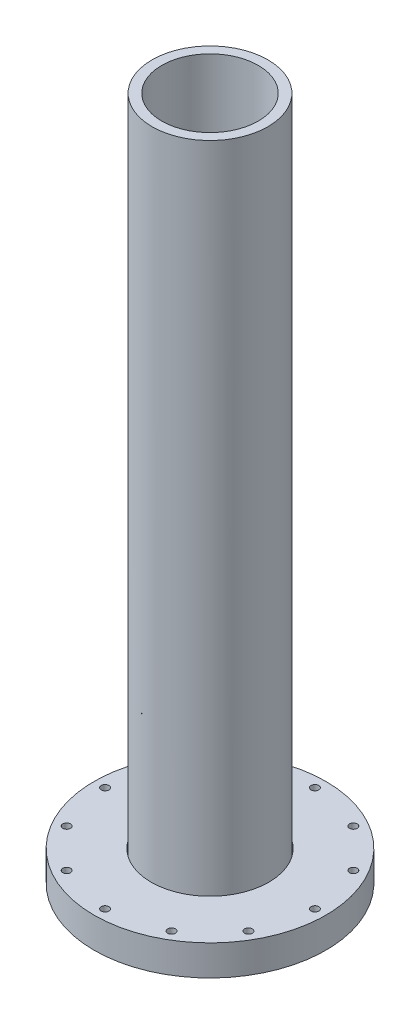
ISO-10303-21;
HEADER;
FILE_DESCRIPTION(('STEP AP214'),'2;1');
FILE_NAME('part.step','',(''),(''),'','','');
FILE_SCHEMA(('AUTOMOTIVE_DESIGN { 1 0 10303 214 1 1 1 1 }'));
ENDSEC;
DATA;
#1=APPLICATION_CONTEXT('core data for automotive mechanical design processes');
#2=APPLICATION_PROTOCOL_DEFINITION('international standard','automotive_design',2000,#1);
#3=PRODUCT_CONTEXT('',#1,'mechanical');
#4=PRODUCT('Part','Part','',(#3));
#5=PRODUCT_RELATED_PRODUCT_CATEGORY('part','',(#4));
#6=PRODUCT_DEFINITION_FORMATION('','',#4);
#7=PRODUCT_DEFINITION_CONTEXT('part definition',#1,'design');
#8=PRODUCT_DEFINITION('design','',#6,#7);
#9=PRODUCT_DEFINITION_SHAPE('','',#8);
#10=(LENGTH_UNIT() NAMED_UNIT(*) SI_UNIT(.MILLI.,.METRE.));
#11=(NAMED_UNIT(*) PLANE_ANGLE_UNIT() SI_UNIT($,.RADIAN.));
#12=(NAMED_UNIT(*) SI_UNIT($,.STERADIAN.) SOLID_ANGLE_UNIT());
#13=UNCERTAINTY_MEASURE_WITH_UNIT(LENGTH_MEASURE(1.E-05),#10,'distance_accuracy_value','');
#14=(GEOMETRIC_REPRESENTATION_CONTEXT(3) GLOBAL_UNCERTAINTY_ASSIGNED_CONTEXT((#13)) GLOBAL_UNIT_ASSIGNED_CONTEXT((#10,
#11,#12)) REPRESENTATION_CONTEXT('',''));
#15=CARTESIAN_POINT('',(0.,0.,0.));
#16=DIRECTION('',(0.,0.,1.));
#17=DIRECTION('',(1.,0.,0.));
#18=AXIS2_PLACEMENT_3D('',#15,#16,#17);
#19=CARTESIAN_POINT('',(0.,20.,0.));
#20=DIRECTION('',(0.,-1.,0.));
#21=DIRECTION('',(0.,0.,-1.));
#22=AXIS2_PLACEMENT_3D('',#19,#20,#21);
#23=CYLINDRICAL_SURFACE('',#22,38.6715);
#24=CARTESIAN_POINT('',(0.,20.,0.));
#25=DIRECTION('',(0.,1.,0.));
#26=DIRECTION('',(0.,0.,1.));
#27=AXIS2_PLACEMENT_3D('',#24,#25,#26);
#28=CIRCLE('',#27,38.6715);
#29=CARTESIAN_POINT('',(0.,20.,38.6715));
#30=VERTEX_POINT('',#29);
#31=EDGE_CURVE('E60',#30,#30,#28,.T.);
#32=ORIENTED_EDGE('',*,*,#31,.T.);
#33=EDGE_LOOP('',(#32));
#34=FACE_BOUND('',#33,.T.);
#35=CARTESIAN_POINT('',(0.,2.,0.));
#36=DIRECTION('',(0.,-1.,0.));
#37=DIRECTION('',(0.,0.,-1.));
#38=AXIS2_PLACEMENT_3D('',#35,#36,#37);
#39=CIRCLE('',#38,38.6715);
#40=CARTESIAN_POINT('',(0.,2.,-38.6715));
#41=VERTEX_POINT('',#40);
#42=EDGE_CURVE('E51',#41,#41,#39,.T.);
#43=ORIENTED_EDGE('',*,*,#42,.T.);
#44=EDGE_LOOP('',(#43));
#45=FACE_BOUND('',#44,.T.);
#46=ADVANCED_FACE('F47',(#34,#45),#23,.F.);
#47=CARTESIAN_POINT('',(0.,0.,0.));
#48=DIRECTION('',(0.,1.,0.));
#49=DIRECTION('',(0.,0.,1.));
#50=AXIS2_PLACEMENT_3D('',#47,#48,#49);
#51=PLANE('',#50);
#52=CARTESIAN_POINT('',(0.,0.,0.));
#53=DIRECTION('',(0.,-1.,0.));
#54=DIRECTION('',(0.,0.,-1.));
#55=AXIS2_PLACEMENT_3D('',#52,#53,#54);
#56=CIRCLE('',#55,55.14);
#57=CARTESIAN_POINT('',(0.,0.,-55.14));
#58=VERTEX_POINT('',#57);
#59=EDGE_CURVE('E140',#58,#58,#56,.T.);
#60=ORIENTED_EDGE('',*,*,#59,.F.);
#61=EDGE_LOOP('',(#60));
#62=FACE_BOUND('',#61,.T.);
#63=CARTESIAN_POINT('',(59.7557528611262,0.,-34.5000000000001));
#64=DIRECTION('',(0.,-1.,0.));
#65=DIRECTION('',(0.,0.,-1.));
#66=AXIS2_PLACEMENT_3D('',#63,#64,#65);
#67=CIRCLE('',#66,2.55269999999994);
#68=CARTESIAN_POINT('',(59.7557528611262,0.,-37.0527));
#69=VERTEX_POINT('',#68);
#70=EDGE_CURVE('E131',#69,#69,#67,.T.);
#71=ORIENTED_EDGE('',*,*,#70,.F.);
#72=EDGE_LOOP('',(#71));
#73=FACE_BOUND('',#72,.T.);
#74=CARTESIAN_POINT('',(34.4999999999999,0.,-59.7557528611264));
#75=DIRECTION('',(0.,-1.,0.));
#76=DIRECTION('',(0.,0.,-1.));
#77=AXIS2_PLACEMENT_3D('',#74,#75,#76);
#78=CIRCLE('',#77,2.55269999999994);
#79=CARTESIAN_POINT('',(34.4999999999999,0.,-62.3084528611263));
#80=VERTEX_POINT('',#79);
#81=EDGE_CURVE('E125',#80,#80,#78,.T.);
#82=ORIENTED_EDGE('',*,*,#81,.F.);
#83=EDGE_LOOP('',(#82));
#84=FACE_BOUND('',#83,.T.);
#85=CARTESIAN_POINT('',(-2.40912212380176E-13,0.,-69.));
#86=DIRECTION('',(0.,-1.,0.));
#87=DIRECTION('',(0.,0.,-1.));
#88=AXIS2_PLACEMENT_3D('',#85,#86,#87);
#89=CIRCLE('',#88,2.55269999999995);
#90=CARTESIAN_POINT('',(-2.40912212380176E-13,0.,-71.5527));
#91=VERTEX_POINT('',#90);
#92=EDGE_CURVE('E119',#91,#91,#89,.T.);
#93=ORIENTED_EDGE('',*,*,#92,.F.);
#94=EDGE_LOOP('',(#93));
#95=FACE_BOUND('',#94,.T.);
#96=CARTESIAN_POINT('',(-34.5000000000003,0.,-59.7557528611261));
#97=DIRECTION('',(0.,-1.,0.));
#98=DIRECTION('',(0.,0.,-1.));
#99=AXIS2_PLACEMENT_3D('',#96,#97,#98);
#100=CIRCLE('',#99,2.55269999999994);
#101=CARTESIAN_POINT('',(-34.5000000000003,0.,-62.3084528611261));
#102=VERTEX_POINT('',#101);
#103=EDGE_CURVE('E113',#102,#102,#100,.T.);
#104=ORIENTED_EDGE('',*,*,#103,.F.);
#105=EDGE_LOOP('',(#104));
#106=FACE_BOUND('',#105,.T.);
#107=CARTESIAN_POINT('',(-59.7557528611265,0.,-34.4999999999997));
#108=DIRECTION('',(0.,-1.,0.));
#109=DIRECTION('',(0.,0.,-1.));
#110=AXIS2_PLACEMENT_3D('',#107,#108,#109);
#111=CIRCLE('',#110,2.55269999999994);
#112=CARTESIAN_POINT('',(-59.7557528611265,0.,-37.0526999999996));
#113=VERTEX_POINT('',#112);
#114=EDGE_CURVE('E107',#113,#113,#111,.T.);
#115=ORIENTED_EDGE('',*,*,#114,.F.);
#116=EDGE_LOOP('',(#115));
#117=FACE_BOUND('',#116,.T.);
#118=CARTESIAN_POINT('',(-69.,0.,4.81824424760352E-13));
#119=DIRECTION('',(0.,-1.,0.));
#120=DIRECTION('',(0.,0.,-1.));
#121=AXIS2_PLACEMENT_3D('',#118,#119,#120);
#122=CIRCLE('',#121,2.55269999999995);
#123=CARTESIAN_POINT('',(-69.,0.,-2.55269999999947));
#124=VERTEX_POINT('',#123);
#125=EDGE_CURVE('E101',#124,#124,#122,.T.);
#126=ORIENTED_EDGE('',*,*,#125,.F.);
#127=EDGE_LOOP('',(#126));
#128=FACE_BOUND('',#127,.T.);
#129=CARTESIAN_POINT('',(-59.755752861126,0.,34.5000000000005));
#130=DIRECTION('',(0.,-1.,0.));
#131=DIRECTION('',(0.,0.,-1.));
#132=AXIS2_PLACEMENT_3D('',#129,#130,#131);
#133=CIRCLE('',#132,2.55269999999994);
#134=CARTESIAN_POINT('',(-59.755752861126,0.,31.9473000000006));
#135=VERTEX_POINT('',#134);
#136=EDGE_CURVE('E95',#135,#135,#133,.T.);
#137=ORIENTED_EDGE('',*,*,#136,.F.);
#138=EDGE_LOOP('',(#137));
#139=FACE_BOUND('',#138,.T.);
#140=CARTESIAN_POINT('',(-34.4999999999994,0.,59.7557528611266));
#141=DIRECTION('',(0.,-1.,0.));
#142=DIRECTION('',(0.,0.,-1.));
#143=AXIS2_PLACEMENT_3D('',#140,#141,#142);
#144=CIRCLE('',#143,2.55269999999994);
#145=CARTESIAN_POINT('',(-34.4999999999994,0.,57.2030528611266));
#146=VERTEX_POINT('',#145);
#147=EDGE_CURVE('E89',#146,#146,#144,.T.);
#148=ORIENTED_EDGE('',*,*,#147,.F.);
#149=EDGE_LOOP('',(#148));
#150=FACE_BOUND('',#149,.T.);
#151=CARTESIAN_POINT('',(7.22736637140529E-13,0.,69.));
#152=DIRECTION('',(0.,-1.,0.));
#153=DIRECTION('',(0.,0.,-1.));
#154=AXIS2_PLACEMENT_3D('',#151,#152,#153);
#155=CIRCLE('',#154,2.55269999999995);
#156=CARTESIAN_POINT('',(7.22736637140529E-13,0.,66.4473000000001));
#157=VERTEX_POINT('',#156);
#158=EDGE_CURVE('E83',#157,#157,#155,.T.);
#159=ORIENTED_EDGE('',*,*,#158,.F.);
#160=EDGE_LOOP('',(#159));
#161=FACE_BOUND('',#160,.T.);
#162=CARTESIAN_POINT('',(34.5000000000007,0.,59.7557528611259));
#163=DIRECTION('',(0.,-1.,0.));
#164=DIRECTION('',(0.,0.,-1.));
#165=AXIS2_PLACEMENT_3D('',#162,#163,#164);
#166=CIRCLE('',#165,2.55269999999994);
#167=CARTESIAN_POINT('',(34.5000000000007,0.,57.2030528611259));
#168=VERTEX_POINT('',#167);
#169=EDGE_CURVE('E75',#168,#168,#166,.T.);
#170=ORIENTED_EDGE('',*,*,#169,.F.);
#171=EDGE_LOOP('',(#170));
#172=FACE_BOUND('',#171,.T.);
#173=CARTESIAN_POINT('',(59.7557528611267,0.,34.4999999999992));
#174=DIRECTION('',(0.,-1.,0.));
#175=DIRECTION('',(0.,0.,-1.));
#176=AXIS2_PLACEMENT_3D('',#173,#174,#175);
#177=CIRCLE('',#176,2.55269999999994);
#178=CARTESIAN_POINT('',(59.7557528611267,0.,31.9472999999993));
#179=VERTEX_POINT('',#178);
#180=EDGE_CURVE('E66',#179,#179,#177,.T.);
#181=ORIENTED_EDGE('',*,*,#180,.F.);
#182=EDGE_LOOP('',(#181));
#183=FACE_BOUND('',#182,.T.);
#184=CARTESIAN_POINT('',(0.,0.,0.));
#185=DIRECTION('',(0.,1.,0.));
#186=DIRECTION('',(0.,0.,1.));
#187=AXIS2_PLACEMENT_3D('',#184,#185,#186);
#188=CIRCLE('',#187,76.2);
#189=CARTESIAN_POINT('',(0.,0.,76.2));
#190=VERTEX_POINT('',#189);
#191=EDGE_CURVE('E55',#190,#190,#188,.T.);
#192=ORIENTED_EDGE('',*,*,#191,.F.);
#193=EDGE_LOOP('',(#192));
#194=FACE_BOUND('',#193,.T.);
#195=CARTESIAN_POINT('',(69.,0.,0.));
#196=DIRECTION('',(0.,-1.,0.));
#197=DIRECTION('',(0.,0.,-1.));
#198=AXIS2_PLACEMENT_3D('',#195,#196,#197);
#199=CIRCLE('',#198,2.55269999999995);
#200=CARTESIAN_POINT('',(69.,0.,-2.55269999999995));
#201=VERTEX_POINT('',#200);
#202=EDGE_CURVE('E137',#201,#201,#199,.T.);
#203=ORIENTED_EDGE('',*,*,#202,.F.);
#204=EDGE_LOOP('',(#203));
#205=FACE_BOUND('',#204,.T.);
#206=ADVANCED_FACE('F162',(#62,#73,#84,#95,#106,#117,#128,#139,#150,#161,#172,#183,#194,#205),
#51,.F.);
#207=CARTESIAN_POINT('',(0.,20.,0.));
#208=DIRECTION('',(0.,1.,0.));
#209=DIRECTION('',(0.,0.,1.));
#210=AXIS2_PLACEMENT_3D('',#207,#208,#209);
#211=PLANE('',#210);
#212=CARTESIAN_POINT('',(69.,20.,0.));
#213=DIRECTION('',(0.,1.,0.));
#214=DIRECTION('',(0.,0.,1.));
#215=AXIS2_PLACEMENT_3D('',#212,#213,#214);
#216=CIRCLE('',#215,2.55269999999995);
#217=CARTESIAN_POINT('',(69.,20.,2.55269999999995));
#218=VERTEX_POINT('',#217);
#219=EDGE_CURVE('E134',#218,#218,#216,.T.);
#220=ORIENTED_EDGE('',*,*,#219,.F.);
#221=EDGE_LOOP('',(#220));
#222=FACE_BOUND('',#221,.T.);
#223=CARTESIAN_POINT('',(59.7557528611262,20.,-34.5000000000001));
#224=DIRECTION('',(0.,1.,0.));
#225=DIRECTION('',(0.,0.,1.));
#226=AXIS2_PLACEMENT_3D('',#223,#224,#225);
#227=CIRCLE('',#226,2.55269999999994);
#228=CARTESIAN_POINT('',(59.7557528611262,20.,-31.9473000000001));
#229=VERTEX_POINT('',#228);
#230=EDGE_CURVE('E128',#229,#229,#227,.T.);
#231=ORIENTED_EDGE('',*,*,#230,.F.);
#232=EDGE_LOOP('',(#231));
#233=FACE_BOUND('',#232,.T.);
#234=CARTESIAN_POINT('',(34.4999999999999,20.,-59.7557528611264));
#235=DIRECTION('',(0.,1.,0.));
#236=DIRECTION('',(0.,0.,1.));
#237=AXIS2_PLACEMENT_3D('',#234,#235,#236);
#238=CIRCLE('',#237,2.55269999999994);
#239=CARTESIAN_POINT('',(34.4999999999999,20.,-57.2030528611264));
#240=VERTEX_POINT('',#239);
#241=EDGE_CURVE('E122',#240,#240,#238,.T.);
#242=ORIENTED_EDGE('',*,*,#241,.F.);
#243=EDGE_LOOP('',(#242));
#244=FACE_BOUND('',#243,.T.);
#245=CARTESIAN_POINT('',(-2.40912212380176E-13,20.,-69.));
#246=DIRECTION('',(0.,1.,0.));
#247=DIRECTION('',(0.,0.,1.));
#248=AXIS2_PLACEMENT_3D('',#245,#246,#247);
#249=CIRCLE('',#248,2.55269999999994);
#250=CARTESIAN_POINT('',(-2.40912212380176E-13,20.,-66.4473000000001));
#251=VERTEX_POINT('',#250);
#252=EDGE_CURVE('E116',#251,#251,#249,.T.);
#253=ORIENTED_EDGE('',*,*,#252,.F.);
#254=EDGE_LOOP('',(#253));
#255=FACE_BOUND('',#254,.T.);
#256=CARTESIAN_POINT('',(-34.5000000000003,20.,-59.7557528611261));
#257=DIRECTION('',(0.,1.,0.));
#258=DIRECTION('',(0.,0.,1.));
#259=AXIS2_PLACEMENT_3D('',#256,#257,#258);
#260=CIRCLE('',#259,2.55269999999994);
#261=CARTESIAN_POINT('',(-34.5000000000003,20.,-57.2030528611262));
#262=VERTEX_POINT('',#261);
#263=EDGE_CURVE('E110',#262,#262,#260,.T.);
#264=ORIENTED_EDGE('',*,*,#263,.F.);
#265=EDGE_LOOP('',(#264));
#266=FACE_BOUND('',#265,.T.);
#267=CARTESIAN_POINT('',(-59.7557528611265,20.,-34.4999999999997));
#268=DIRECTION('',(0.,1.,0.));
#269=DIRECTION('',(0.,0.,1.));
#270=AXIS2_PLACEMENT_3D('',#267,#268,#269);
#271=CIRCLE('',#270,2.55269999999994);
#272=CARTESIAN_POINT('',(-59.7557528611265,20.,-31.9472999999997));
#273=VERTEX_POINT('',#272);
#274=EDGE_CURVE('E104',#273,#273,#271,.T.);
#275=ORIENTED_EDGE('',*,*,#274,.F.);
#276=EDGE_LOOP('',(#275));
#277=FACE_BOUND('',#276,.T.);
#278=CARTESIAN_POINT('',(-69.,20.,4.81824424760352E-13));
#279=DIRECTION('',(0.,1.,0.));
#280=DIRECTION('',(0.,0.,1.));
#281=AXIS2_PLACEMENT_3D('',#278,#279,#280);
#282=CIRCLE('',#281,2.55269999999995);
#283=CARTESIAN_POINT('',(-69.,20.,2.55270000000043));
#284=VERTEX_POINT('',#283);
#285=EDGE_CURVE('E98',#284,#284,#282,.T.);
#286=ORIENTED_EDGE('',*,*,#285,.F.);
#287=EDGE_LOOP('',(#286));
#288=FACE_BOUND('',#287,.T.);
#289=CARTESIAN_POINT('',(-59.755752861126,20.,34.5000000000005));
#290=DIRECTION('',(0.,1.,0.));
#291=DIRECTION('',(0.,0.,1.));
#292=AXIS2_PLACEMENT_3D('',#289,#290,#291);
#293=CIRCLE('',#292,2.55269999999994);
#294=CARTESIAN_POINT('',(-59.755752861126,20.,37.0527000000004));
#295=VERTEX_POINT('',#294);
#296=EDGE_CURVE('E92',#295,#295,#293,.T.);
#297=ORIENTED_EDGE('',*,*,#296,.F.);
#298=EDGE_LOOP('',(#297));
#299=FACE_BOUND('',#298,.T.);
#300=CARTESIAN_POINT('',(-34.4999999999994,20.,59.7557528611266));
#301=DIRECTION('',(0.,1.,0.));
#302=DIRECTION('',(0.,0.,1.));
#303=AXIS2_PLACEMENT_3D('',#300,#301,#302);
#304=CIRCLE('',#303,2.55269999999994);
#305=CARTESIAN_POINT('',(-34.4999999999994,20.,62.3084528611265));
#306=VERTEX_POINT('',#305);
#307=EDGE_CURVE('E86',#306,#306,#304,.T.);
#308=ORIENTED_EDGE('',*,*,#307,.F.);
#309=EDGE_LOOP('',(#308));
#310=FACE_BOUND('',#309,.T.);
#311=CARTESIAN_POINT('',(7.22736637140529E-13,20.,69.));
#312=DIRECTION('',(0.,1.,0.));
#313=DIRECTION('',(0.,0.,1.));
#314=AXIS2_PLACEMENT_3D('',#311,#312,#313);
#315=CIRCLE('',#314,2.55269999999994);
#316=CARTESIAN_POINT('',(7.22736637140529E-13,20.,71.5527));
#317=VERTEX_POINT('',#316);
#318=EDGE_CURVE('E80',#317,#317,#315,.T.);
#319=ORIENTED_EDGE('',*,*,#318,.F.);
#320=EDGE_LOOP('',(#319));
#321=FACE_BOUND('',#320,.T.);
#322=CARTESIAN_POINT('',(34.5000000000007,20.,59.7557528611259));
#323=DIRECTION('',(0.,1.,0.));
#324=DIRECTION('',(0.,0.,1.));
#325=AXIS2_PLACEMENT_3D('',#322,#323,#324);
#326=CIRCLE('',#325,2.55269999999994);
#327=CARTESIAN_POINT('',(34.5000000000007,20.,62.3084528611258));
#328=VERTEX_POINT('',#327);
#329=EDGE_CURVE('E71',#328,#328,#326,.T.);
#330=ORIENTED_EDGE('',*,*,#329,.F.);
#331=EDGE_LOOP('',(#330));
#332=FACE_BOUND('',#331,.T.);
#333=CARTESIAN_POINT('',(59.7557528611267,20.,34.4999999999992));
#334=DIRECTION('',(0.,1.,0.));
#335=DIRECTION('',(0.,0.,1.));
#336=AXIS2_PLACEMENT_3D('',#333,#334,#335);
#337=CIRCLE('',#336,2.55269999999994);
#338=CARTESIAN_POINT('',(59.7557528611267,20.,37.0526999999992));
#339=VERTEX_POINT('',#338);
#340=EDGE_CURVE('E64',#339,#339,#337,.T.);
#341=ORIENTED_EDGE('',*,*,#340,.F.);
#342=EDGE_LOOP('',(#341));
#343=FACE_BOUND('',#342,.T.);
#344=CARTESIAN_POINT('',(0.,20.,0.));
#345=DIRECTION('',(0.,1.,0.));
#346=DIRECTION('',(0.,0.,1.));
#347=AXIS2_PLACEMENT_3D('',#344,#345,#346);
#348=CIRCLE('',#347,76.2);
#349=CARTESIAN_POINT('',(0.,20.,76.2));
#350=VERTEX_POINT('',#349);
#351=EDGE_CURVE('E11',#350,#350,#348,.T.);
#352=ORIENTED_EDGE('',*,*,#351,.T.);
#353=EDGE_LOOP('',(#352));
#354=FACE_BOUND('',#353,.T.);
#355=ORIENTED_EDGE('',*,*,#31,.F.);
#356=EDGE_LOOP('',(#355));
#357=FACE_BOUND('',#356,.T.);
#358=ADVANCED_FACE('F168',(#222,#233,#244,#255,#266,#277,#288,#299,#310,#321,#332,#343,#354,
#357),#211,.T.);
#359=CARTESIAN_POINT('',(0.,20.,0.));
#360=DIRECTION('',(0.,-1.,0.));
#361=DIRECTION('',(0.,0.,-1.));
#362=AXIS2_PLACEMENT_3D('',#359,#360,#361);
#363=CYLINDRICAL_SURFACE('',#362,76.2);
#364=ORIENTED_EDGE('',*,*,#351,.F.);
#365=EDGE_LOOP('',(#364));
#366=FACE_BOUND('',#365,.T.);
#367=ORIENTED_EDGE('',*,*,#191,.T.);
#368=EDGE_LOOP('',(#367));
#369=FACE_BOUND('',#368,.T.);
#370=ADVANCED_FACE('F49',(#366,#369),#363,.T.);
#371=CARTESIAN_POINT('',(59.7557528611267,0.,34.4999999999992));
#372=DIRECTION('',(0.,-1.,0.));
#373=DIRECTION('',(0.,0.,-1.));
#374=AXIS2_PLACEMENT_3D('',#371,#372,#373);
#375=CYLINDRICAL_SURFACE('',#374,2.55269999999994);
#376=ORIENTED_EDGE('',*,*,#340,.T.);
#377=EDGE_LOOP('',(#376));
#378=FACE_BOUND('',#377,.T.);
#379=ORIENTED_EDGE('',*,*,#180,.T.);
#380=EDGE_LOOP('',(#379));
#381=FACE_BOUND('',#380,.T.);
#382=ADVANCED_FACE('F172',(#378,#381),#375,.F.);
#383=CARTESIAN_POINT('',(34.5000000000007,0.,59.7557528611259));
#384=DIRECTION('',(0.,-1.,0.));
#385=DIRECTION('',(0.,0.,-1.));
#386=AXIS2_PLACEMENT_3D('',#383,#384,#385);
#387=CYLINDRICAL_SURFACE('',#386,2.55269999999994);
#388=ORIENTED_EDGE('',*,*,#329,.T.);
#389=EDGE_LOOP('',(#388));
#390=FACE_BOUND('',#389,.T.);
#391=ORIENTED_EDGE('',*,*,#169,.T.);
#392=EDGE_LOOP('',(#391));
#393=FACE_BOUND('',#392,.T.);
#394=ADVANCED_FACE('F205',(#390,#393),#387,.F.);
#395=CARTESIAN_POINT('',(7.22736637140529E-13,0.,69.));
#396=DIRECTION('',(0.,-1.,0.));
#397=DIRECTION('',(0.,0.,-1.));
#398=AXIS2_PLACEMENT_3D('',#395,#396,#397);
#399=CYLINDRICAL_SURFACE('',#398,2.55269999999994);
#400=ORIENTED_EDGE('',*,*,#318,.T.);
#401=EDGE_LOOP('',(#400));
#402=FACE_BOUND('',#401,.T.);
#403=ORIENTED_EDGE('',*,*,#158,.T.);
#404=EDGE_LOOP('',(#403));
#405=FACE_BOUND('',#404,.T.);
#406=ADVANCED_FACE('F208',(#402,#405),#399,.F.);
#407=CARTESIAN_POINT('',(-34.4999999999994,0.,59.7557528611266));
#408=DIRECTION('',(0.,-1.,0.));
#409=DIRECTION('',(0.,0.,-1.));
#410=AXIS2_PLACEMENT_3D('',#407,#408,#409);
#411=CYLINDRICAL_SURFACE('',#410,2.55269999999994);
#412=ORIENTED_EDGE('',*,*,#307,.T.);
#413=EDGE_LOOP('',(#412));
#414=FACE_BOUND('',#413,.T.);
#415=ORIENTED_EDGE('',*,*,#147,.T.);
#416=EDGE_LOOP('',(#415));
#417=FACE_BOUND('',#416,.T.);
#418=ADVANCED_FACE('F250',(#414,#417),#411,.F.);
#419=CARTESIAN_POINT('',(-59.755752861126,0.,34.5000000000005));
#420=DIRECTION('',(0.,-1.,0.));
#421=DIRECTION('',(0.,0.,-1.));
#422=AXIS2_PLACEMENT_3D('',#419,#420,#421);
#423=CYLINDRICAL_SURFACE('',#422,2.55269999999994);
#424=ORIENTED_EDGE('',*,*,#296,.T.);
#425=EDGE_LOOP('',(#424));
#426=FACE_BOUND('',#425,.T.);
#427=ORIENTED_EDGE('',*,*,#136,.T.);
#428=EDGE_LOOP('',(#427));
#429=FACE_BOUND('',#428,.T.);
#430=ADVANCED_FACE('F246',(#426,#429),#423,.F.);
#431=CARTESIAN_POINT('',(-69.,0.,4.81824424760352E-13));
#432=DIRECTION('',(0.,-1.,0.));
#433=DIRECTION('',(0.,0.,-1.));
#434=AXIS2_PLACEMENT_3D('',#431,#432,#433);
#435=CYLINDRICAL_SURFACE('',#434,2.55269999999995);
#436=ORIENTED_EDGE('',*,*,#285,.T.);
#437=EDGE_LOOP('',(#436));
#438=FACE_BOUND('',#437,.T.);
#439=ORIENTED_EDGE('',*,*,#125,.T.);
#440=EDGE_LOOP('',(#439));
#441=FACE_BOUND('',#440,.T.);
#442=ADVANCED_FACE('F242',(#438,#441),#435,.F.);
#443=CARTESIAN_POINT('',(-59.7557528611265,0.,-34.4999999999997));
#444=DIRECTION('',(0.,-1.,0.));
#445=DIRECTION('',(0.,0.,-1.));
#446=AXIS2_PLACEMENT_3D('',#443,#444,#445);
#447=CYLINDRICAL_SURFACE('',#446,2.55269999999994);
#448=ORIENTED_EDGE('',*,*,#274,.T.);
#449=EDGE_LOOP('',(#448));
#450=FACE_BOUND('',#449,.T.);
#451=ORIENTED_EDGE('',*,*,#114,.T.);
#452=EDGE_LOOP('',(#451));
#453=FACE_BOUND('',#452,.T.);
#454=ADVANCED_FACE('F238',(#450,#453),#447,.F.);
#455=CARTESIAN_POINT('',(-34.5000000000003,0.,-59.7557528611261));
#456=DIRECTION('',(0.,-1.,0.));
#457=DIRECTION('',(0.,0.,-1.));
#458=AXIS2_PLACEMENT_3D('',#455,#456,#457);
#459=CYLINDRICAL_SURFACE('',#458,2.55269999999994);
#460=ORIENTED_EDGE('',*,*,#263,.T.);
#461=EDGE_LOOP('',(#460));
#462=FACE_BOUND('',#461,.T.);
#463=ORIENTED_EDGE('',*,*,#103,.T.);
#464=EDGE_LOOP('',(#463));
#465=FACE_BOUND('',#464,.T.);
#466=ADVANCED_FACE('F234',(#462,#465),#459,.F.);
#467=CARTESIAN_POINT('',(-2.40912212380176E-13,0.,-69.));
#468=DIRECTION('',(0.,-1.,0.));
#469=DIRECTION('',(0.,0.,-1.));
#470=AXIS2_PLACEMENT_3D('',#467,#468,#469);
#471=CYLINDRICAL_SURFACE('',#470,2.55269999999994);
#472=ORIENTED_EDGE('',*,*,#252,.T.);
#473=EDGE_LOOP('',(#472));
#474=FACE_BOUND('',#473,.T.);
#475=ORIENTED_EDGE('',*,*,#92,.T.);
#476=EDGE_LOOP('',(#475));
#477=FACE_BOUND('',#476,.T.);
#478=ADVANCED_FACE('F230',(#474,#477),#471,.F.);
#479=CARTESIAN_POINT('',(34.4999999999999,0.,-59.7557528611264));
#480=DIRECTION('',(0.,-1.,0.));
#481=DIRECTION('',(0.,0.,-1.));
#482=AXIS2_PLACEMENT_3D('',#479,#480,#481);
#483=CYLINDRICAL_SURFACE('',#482,2.55269999999994);
#484=ORIENTED_EDGE('',*,*,#241,.T.);
#485=EDGE_LOOP('',(#484));
#486=FACE_BOUND('',#485,.T.);
#487=ORIENTED_EDGE('',*,*,#81,.T.);
#488=EDGE_LOOP('',(#487));
#489=FACE_BOUND('',#488,.T.);
#490=ADVANCED_FACE('F224',(#486,#489),#483,.F.);
#491=CARTESIAN_POINT('',(59.7557528611262,0.,-34.5000000000001));
#492=DIRECTION('',(0.,-1.,0.));
#493=DIRECTION('',(0.,0.,-1.));
#494=AXIS2_PLACEMENT_3D('',#491,#492,#493);
#495=CYLINDRICAL_SURFACE('',#494,2.55269999999994);
#496=ORIENTED_EDGE('',*,*,#230,.T.);
#497=EDGE_LOOP('',(#496));
#498=FACE_BOUND('',#497,.T.);
#499=ORIENTED_EDGE('',*,*,#70,.T.);
#500=EDGE_LOOP('',(#499));
#501=FACE_BOUND('',#500,.T.);
#502=ADVANCED_FACE('F218',(#498,#501),#495,.F.);
#503=CARTESIAN_POINT('',(69.,0.,0.));
#504=DIRECTION('',(0.,-1.,0.));
#505=DIRECTION('',(0.,0.,-1.));
#506=AXIS2_PLACEMENT_3D('',#503,#504,#505);
#507=CYLINDRICAL_SURFACE('',#506,2.55269999999995);
#508=ORIENTED_EDGE('',*,*,#219,.T.);
#509=EDGE_LOOP('',(#508));
#510=FACE_BOUND('',#509,.T.);
#511=ORIENTED_EDGE('',*,*,#202,.T.);
#512=EDGE_LOOP('',(#511));
#513=FACE_BOUND('',#512,.T.);
#514=ADVANCED_FACE('F158',(#510,#513),#507,.F.);
#515=CARTESIAN_POINT('',(0.,2.,0.));
#516=DIRECTION('',(0.,-1.,0.));
#517=DIRECTION('',(0.,0.,-1.));
#518=AXIS2_PLACEMENT_3D('',#515,#516,#517);
#519=CYLINDRICAL_SURFACE('',#518,55.14);
#520=CARTESIAN_POINT('',(0.,2.,0.));
#521=DIRECTION('',(0.,-1.,0.));
#522=DIRECTION('',(0.,0.,-1.));
#523=AXIS2_PLACEMENT_3D('',#520,#521,#522);
#524=CIRCLE('',#523,55.14);
#525=CARTESIAN_POINT('',(0.,2.,-55.14));
#526=VERTEX_POINT('',#525);
#527=EDGE_CURVE('E143',#526,#526,#524,.T.);
#528=ORIENTED_EDGE('',*,*,#527,.F.);
#529=EDGE_LOOP('',(#528));
#530=FACE_BOUND('',#529,.T.);
#531=ORIENTED_EDGE('',*,*,#59,.T.);
#532=EDGE_LOOP('',(#531));
#533=FACE_BOUND('',#532,.T.);
#534=ADVANCED_FACE('F153',(#530,#533),#519,.F.);
#535=CARTESIAN_POINT('',(0.,2.,0.));
#536=DIRECTION('',(0.,-1.,0.));
#537=DIRECTION('',(0.,0.,-1.));
#538=AXIS2_PLACEMENT_3D('',#535,#536,#537);
#539=PLANE('',#538);
#540=ORIENTED_EDGE('',*,*,#42,.F.);
#541=EDGE_LOOP('',(#540));
#542=FACE_BOUND('',#541,.T.);
#543=ORIENTED_EDGE('',*,*,#527,.T.);
#544=EDGE_LOOP('',(#543));
#545=FACE_BOUND('',#544,.T.);
#546=ADVANCED_FACE('F151',(#542,#545),#539,.T.);
#547=CLOSED_SHELL('',(#46,#206,#358,#370,#382,#394,#406,#418,#430,#442,#454,#466,#478,#490,#502,
#514,#534,#546));
#548=MANIFOLD_SOLID_BREP('B2',#547);
#549=CARTESIAN_POINT('',(0.,450.,0.));
#550=DIRECTION('',(0.,-1.,0.));
#551=DIRECTION('',(0.,0.,-1.));
#552=AXIS2_PLACEMENT_3D('',#549,#550,#551);
#553=CYLINDRICAL_SURFACE('',#552,38.1);
#554=CARTESIAN_POINT('',(0.,450.,0.));
#555=DIRECTION('',(0.,1.,0.));
#556=DIRECTION('',(0.,0.,1.));
#557=AXIS2_PLACEMENT_3D('',#554,#555,#556);
#558=CIRCLE('',#557,38.1);
#559=CARTESIAN_POINT('',(0.,450.,38.1));
#560=VERTEX_POINT('',#559);
#561=EDGE_CURVE('E46',#560,#560,#558,.T.);
#562=ORIENTED_EDGE('',*,*,#561,.F.);
#563=EDGE_LOOP('',(#562));
#564=FACE_BOUND('',#563,.T.);
#565=CARTESIAN_POINT('',(0.,2.,0.));
#566=DIRECTION('',(0.,-1.,0.));
#567=DIRECTION('',(0.,0.,-1.));
#568=AXIS2_PLACEMENT_3D('',#565,#566,#567);
#569=CIRCLE('',#568,38.1);
#570=CARTESIAN_POINT('',(0.,2.,-38.1));
#571=VERTEX_POINT('',#570);
#572=EDGE_CURVE('E404',#571,#571,#569,.T.);
#573=ORIENTED_EDGE('',*,*,#572,.F.);
#574=EDGE_LOOP('',(#573));
#575=FACE_BOUND('',#574,.T.);
#576=ADVANCED_FACE('F391',(#564,#575),#553,.T.);
#577=CARTESIAN_POINT('',(0.,450.,0.));
#578=DIRECTION('',(0.,-1.,0.));
#579=DIRECTION('',(0.,0.,-1.));
#580=AXIS2_PLACEMENT_3D('',#577,#578,#579);
#581=CYLINDRICAL_SURFACE('',#580,31.75);
#582=CARTESIAN_POINT('',(0.,450.,0.));
#583=DIRECTION('',(0.,1.,0.));
#584=DIRECTION('',(0.,0.,1.));
#585=AXIS2_PLACEMENT_3D('',#582,#583,#584);
#586=CIRCLE('',#585,31.75);
#587=CARTESIAN_POINT('',(0.,450.,31.75));
#588=VERTEX_POINT('',#587);
#589=EDGE_CURVE('E399',#588,#588,#586,.T.);
#590=ORIENTED_EDGE('',*,*,#589,.T.);
#591=EDGE_LOOP('',(#590));
#592=FACE_BOUND('',#591,.T.);
#593=CARTESIAN_POINT('',(0.,2.,0.));
#594=DIRECTION('',(0.,-1.,0.));
#595=DIRECTION('',(0.,0.,-1.));
#596=AXIS2_PLACEMENT_3D('',#593,#594,#595);
#597=CIRCLE('',#596,31.75);
#598=CARTESIAN_POINT('',(0.,2.,-31.75));
#599=VERTEX_POINT('',#598);
#600=EDGE_CURVE('E394',#599,#599,#597,.T.);
#601=ORIENTED_EDGE('',*,*,#600,.T.);
#602=EDGE_LOOP('',(#601));
#603=FACE_BOUND('',#602,.T.);
#604=ADVANCED_FACE('F415',(#592,#603),#581,.F.);
#605=CARTESIAN_POINT('',(0.,450.,0.));
#606=DIRECTION('',(0.,1.,0.));
#607=DIRECTION('',(0.,0.,1.));
#608=AXIS2_PLACEMENT_3D('',#605,#606,#607);
#609=PLANE('',#608);
#610=ORIENTED_EDGE('',*,*,#561,.T.);
#611=EDGE_LOOP('',(#610));
#612=FACE_BOUND('',#611,.T.);
#613=ORIENTED_EDGE('',*,*,#589,.F.);
#614=EDGE_LOOP('',(#613));
#615=FACE_BOUND('',#614,.T.);
#616=ADVANCED_FACE('F419',(#612,#615),#609,.T.);
#617=CARTESIAN_POINT('',(0.,2.,0.));
#618=DIRECTION('',(0.,-1.,0.));
#619=DIRECTION('',(0.,0.,-1.));
#620=AXIS2_PLACEMENT_3D('',#617,#618,#619);
#621=PLANE('',#620);
#622=ORIENTED_EDGE('',*,*,#600,.F.);
#623=EDGE_LOOP('',(#622));
#624=FACE_BOUND('',#623,.T.);
#625=ORIENTED_EDGE('',*,*,#572,.T.);
#626=EDGE_LOOP('',(#625));
#627=FACE_BOUND('',#626,.T.);
#628=ADVANCED_FACE('F417',(#624,#627),#621,.T.);
#629=CLOSED_SHELL('',(#576,#604,#616,#628));
#630=MANIFOLD_SOLID_BREP('B6',#629);
#631=ADVANCED_BREP_SHAPE_REPRESENTATION('',(#18,#548,#630),#14);
#632=SHAPE_DEFINITION_REPRESENTATION(#9,#631);
ENDSEC;
END-ISO-10303-21;
